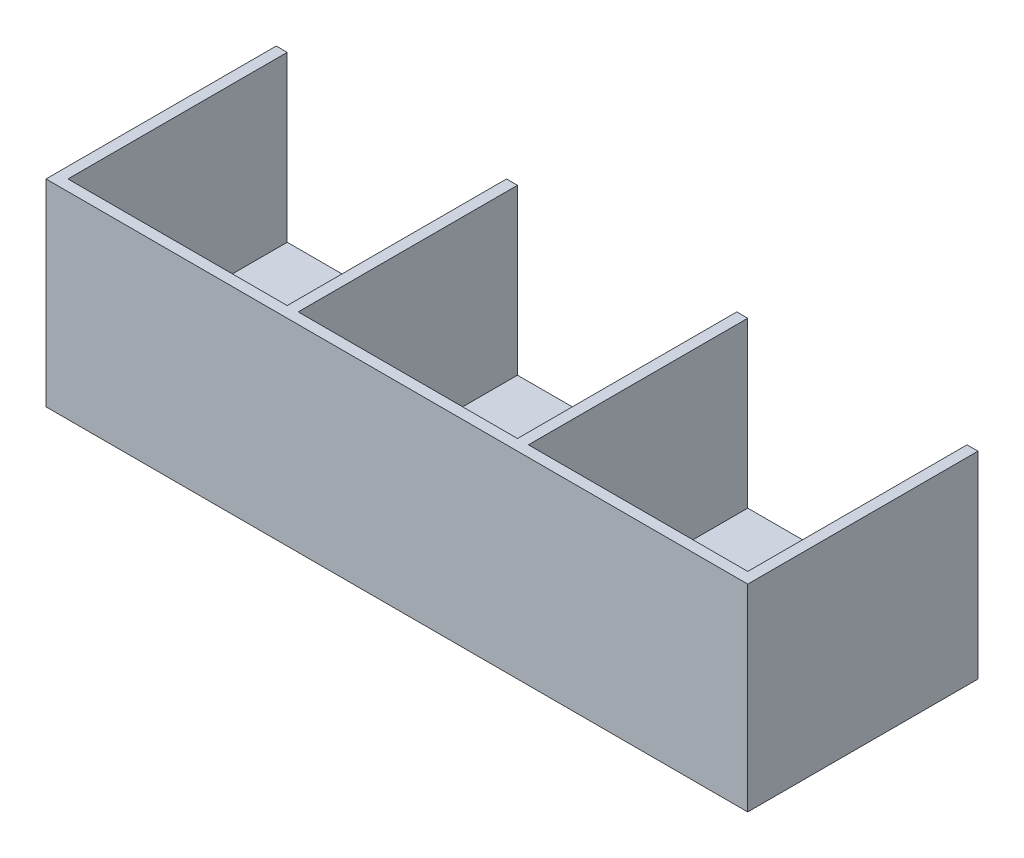
ISO-10303-21;
HEADER;
FILE_DESCRIPTION(('STEP AP214'),'2;1');
FILE_NAME('part.step','',(''),(''),'','','');
FILE_SCHEMA(('AUTOMOTIVE_DESIGN { 1 0 10303 214 1 1 1 1 }'));
ENDSEC;
DATA;
#1=APPLICATION_CONTEXT('core data for automotive mechanical design processes');
#2=APPLICATION_PROTOCOL_DEFINITION('international standard','automotive_design',2000,#1);
#3=PRODUCT_CONTEXT('',#1,'mechanical');
#4=PRODUCT('Part','Part','',(#3));
#5=PRODUCT_RELATED_PRODUCT_CATEGORY('part','',(#4));
#6=PRODUCT_DEFINITION_FORMATION('','',#4);
#7=PRODUCT_DEFINITION_CONTEXT('part definition',#1,'design');
#8=PRODUCT_DEFINITION('design','',#6,#7);
#9=PRODUCT_DEFINITION_SHAPE('','',#8);
#10=(LENGTH_UNIT() NAMED_UNIT(*) SI_UNIT(.MILLI.,.METRE.));
#11=(NAMED_UNIT(*) PLANE_ANGLE_UNIT() SI_UNIT($,.RADIAN.));
#12=(NAMED_UNIT(*) SI_UNIT($,.STERADIAN.) SOLID_ANGLE_UNIT());
#13=UNCERTAINTY_MEASURE_WITH_UNIT(LENGTH_MEASURE(1.E-05),#10,'distance_accuracy_value','');
#14=(GEOMETRIC_REPRESENTATION_CONTEXT(3) GLOBAL_UNCERTAINTY_ASSIGNED_CONTEXT((#13)) GLOBAL_UNIT_ASSIGNED_CONTEXT((#10,
#11,#12)) REPRESENTATION_CONTEXT('',''));
#15=CARTESIAN_POINT('',(0.,0.,0.));
#16=DIRECTION('',(0.,0.,1.));
#17=DIRECTION('',(1.,0.,0.));
#18=AXIS2_PLACEMENT_3D('',#15,#16,#17);
#19=CARTESIAN_POINT('',(0.,150.,0.));
#20=DIRECTION('',(0.,1.,0.));
#21=DIRECTION('',(0.,0.,1.));
#22=AXIS2_PLACEMENT_3D('',#19,#20,#21);
#23=PLANE('',#22);
#24=DIRECTION('',(1.,0.,0.));
#25=VECTOR('',#24,1.);
#26=CARTESIAN_POINT('',(-320.,150.,-100.));
#27=LINE('',#26,#25);
#28=CARTESIAN_POINT('',(-320.,150.,-100.));
#29=VERTEX_POINT('',#28);
#30=CARTESIAN_POINT('',(-310.,150.,-100.));
#31=VERTEX_POINT('',#30);
#32=EDGE_CURVE('E166',#29,#31,#27,.T.);
#33=ORIENTED_EDGE('',*,*,#32,.F.);
#34=DIRECTION('',(0.,0.,1.));
#35=VECTOR('',#34,1.);
#36=CARTESIAN_POINT('',(-320.,150.,-110.));
#37=LINE('',#36,#35);
#38=CARTESIAN_POINT('',(-320.,150.,110.));
#39=VERTEX_POINT('',#38);
#40=EDGE_CURVE('E66',#29,#39,#37,.T.);
#41=ORIENTED_EDGE('',*,*,#40,.T.);
#42=DIRECTION('',(1.,0.,0.));
#43=VECTOR('',#42,1.);
#44=CARTESIAN_POINT('',(-320.,150.,110.));
#45=LINE('',#44,#43);
#46=CARTESIAN_POINT('',(320.,150.,110.));
#47=VERTEX_POINT('',#46);
#48=EDGE_CURVE('E61',#39,#47,#45,.T.);
#49=ORIENTED_EDGE('',*,*,#48,.T.);
#50=DIRECTION('',(0.,0.,-1.));
#51=VECTOR('',#50,1.);
#52=CARTESIAN_POINT('',(320.,150.,-110.));
#53=LINE('',#52,#51);
#54=CARTESIAN_POINT('',(320.,150.,-100.));
#55=VERTEX_POINT('',#54);
#56=EDGE_CURVE('E331',#47,#55,#53,.T.);
#57=ORIENTED_EDGE('',*,*,#56,.T.);
#58=CARTESIAN_POINT('',(310.,150.,-100.));
#59=VERTEX_POINT('',#58);
#60=EDGE_CURVE('E189',#59,#55,#27,.T.);
#61=ORIENTED_EDGE('',*,*,#60,.F.);
#62=DIRECTION('',(0.,0.,-1.));
#63=VECTOR('',#62,1.);
#64=CARTESIAN_POINT('',(310.,150.,-100.));
#65=LINE('',#64,#63);
#66=CARTESIAN_POINT('',(310.,150.,100.));
#67=VERTEX_POINT('',#66);
#68=EDGE_CURVE('E219',#67,#59,#65,.T.);
#69=ORIENTED_EDGE('',*,*,#68,.F.);
#70=DIRECTION('',(1.,0.,0.));
#71=VECTOR('',#70,1.);
#72=CARTESIAN_POINT('',(110.,150.,100.));
#73=LINE('',#72,#71);
#74=CARTESIAN_POINT('',(110.,150.,100.));
#75=VERTEX_POINT('',#74);
#76=EDGE_CURVE('E215',#75,#67,#73,.T.);
#77=ORIENTED_EDGE('',*,*,#76,.F.);
#78=DIRECTION('',(0.,0.,1.));
#79=VECTOR('',#78,1.);
#80=CARTESIAN_POINT('',(110.,150.,-99.9999999999999));
#81=LINE('',#80,#79);
#82=CARTESIAN_POINT('',(110.,150.,-100.));
#83=VERTEX_POINT('',#82);
#84=EDGE_CURVE('E212',#83,#75,#81,.T.);
#85=ORIENTED_EDGE('',*,*,#84,.F.);
#86=CARTESIAN_POINT('',(100.,150.,-100.));
#87=VERTEX_POINT('',#86);
#88=EDGE_CURVE('E577',#87,#83,#27,.T.);
#89=ORIENTED_EDGE('',*,*,#88,.F.);
#90=DIRECTION('',(0.,0.,-1.));
#91=VECTOR('',#90,1.);
#92=CARTESIAN_POINT('',(100.,150.,-100.));
#93=LINE('',#92,#91);
#94=CARTESIAN_POINT('',(100.,150.,100.));
#95=VERTEX_POINT('',#94);
#96=EDGE_CURVE('E259',#95,#87,#93,.T.);
#97=ORIENTED_EDGE('',*,*,#96,.F.);
#98=DIRECTION('',(1.,0.,0.));
#99=VECTOR('',#98,1.);
#100=CARTESIAN_POINT('',(-100.,150.,100.));
#101=LINE('',#100,#99);
#102=CARTESIAN_POINT('',(-100.,150.,100.));
#103=VERTEX_POINT('',#102);
#104=EDGE_CURVE('E255',#103,#95,#101,.T.);
#105=ORIENTED_EDGE('',*,*,#104,.F.);
#106=DIRECTION('',(0.,0.,1.));
#107=VECTOR('',#106,1.);
#108=CARTESIAN_POINT('',(-100.,150.,-100.));
#109=LINE('',#108,#107);
#110=CARTESIAN_POINT('',(-100.,150.,-100.));
#111=VERTEX_POINT('',#110);
#112=EDGE_CURVE('E252',#111,#103,#109,.T.);
#113=ORIENTED_EDGE('',*,*,#112,.F.);
#114=CARTESIAN_POINT('',(-110.,150.,-100.));
#115=VERTEX_POINT('',#114);
#116=EDGE_CURVE('E192',#115,#111,#27,.T.);
#117=ORIENTED_EDGE('',*,*,#116,.F.);
#118=DIRECTION('',(0.,0.,-1.));
#119=VECTOR('',#118,1.);
#120=CARTESIAN_POINT('',(-110.,150.,-100.));
#121=LINE('',#120,#119);
#122=CARTESIAN_POINT('',(-110.,150.,100.));
#123=VERTEX_POINT('',#122);
#124=EDGE_CURVE('E299',#123,#115,#121,.T.);
#125=ORIENTED_EDGE('',*,*,#124,.F.);
#126=DIRECTION('',(1.,0.,0.));
#127=VECTOR('',#126,1.);
#128=CARTESIAN_POINT('',(-310.,150.,100.));
#129=LINE('',#128,#127);
#130=CARTESIAN_POINT('',(-310.,150.,100.));
#131=VERTEX_POINT('',#130);
#132=EDGE_CURVE('E295',#131,#123,#129,.T.);
#133=ORIENTED_EDGE('',*,*,#132,.F.);
#134=DIRECTION('',(0.,0.,1.));
#135=VECTOR('',#134,1.);
#136=CARTESIAN_POINT('',(-310.,150.,-100.));
#137=LINE('',#136,#135);
#138=EDGE_CURVE('E292',#31,#131,#137,.T.);
#139=ORIENTED_EDGE('',*,*,#138,.F.);
#140=EDGE_LOOP('',(#33,#41,#49,#57,#61,#69,#77,#85,#89,#97,#105,#113,#117,#125,#133,#139));
#141=FACE_BOUND('',#140,.T.);
#142=ADVANCED_FACE('F45',(#141),#23,.T.);
#143=CARTESIAN_POINT('',(320.,150.,-110.));
#144=DIRECTION('',(-1.,0.,0.));
#145=DIRECTION('',(0.,0.,1.));
#146=AXIS2_PLACEMENT_3D('',#143,#144,#145);
#147=PLANE('',#146);
#148=DIRECTION('',(0.,-1.,0.));
#149=VECTOR('',#148,1.);
#150=CARTESIAN_POINT('',(320.,150.,110.));
#151=LINE('',#150,#149);
#152=CARTESIAN_POINT('',(320.,-30.,110.));
#153=VERTEX_POINT('',#152);
#154=EDGE_CURVE('E54',#47,#153,#151,.T.);
#155=ORIENTED_EDGE('',*,*,#154,.T.);
#156=DIRECTION('',(0.,0.,1.));
#157=VECTOR('',#156,1.);
#158=CARTESIAN_POINT('',(320.,-30.,110.));
#159=LINE('',#158,#157);
#160=CARTESIAN_POINT('',(320.,-30.,-100.));
#161=VERTEX_POINT('',#160);
#162=EDGE_CURVE('E176',#161,#153,#159,.T.);
#163=ORIENTED_EDGE('',*,*,#162,.F.);
#164=DIRECTION('',(0.,1.,0.));
#165=VECTOR('',#164,1.);
#166=CARTESIAN_POINT('',(320.,-10.,-100.));
#167=LINE('',#166,#165);
#168=EDGE_CURVE('E165',#161,#55,#167,.T.);
#169=ORIENTED_EDGE('',*,*,#168,.T.);
#170=ORIENTED_EDGE('',*,*,#56,.F.);
#171=EDGE_LOOP('',(#155,#163,#169,#170));
#172=FACE_BOUND('',#171,.T.);
#173=ADVANCED_FACE('F47',(#172),#147,.F.);
#174=CARTESIAN_POINT('',(-320.,150.,-110.));
#175=DIRECTION('',(1.,0.,0.));
#176=DIRECTION('',(0.,0.,-1.));
#177=AXIS2_PLACEMENT_3D('',#174,#175,#176);
#178=PLANE('',#177);
#179=ORIENTED_EDGE('',*,*,#40,.F.);
#180=DIRECTION('',(0.,1.,0.));
#181=VECTOR('',#180,1.);
#182=CARTESIAN_POINT('',(-320.,-10.,-100.));
#183=LINE('',#182,#181);
#184=CARTESIAN_POINT('',(-320.,-30.,-100.));
#185=VERTEX_POINT('',#184);
#186=EDGE_CURVE('E158',#185,#29,#183,.T.);
#187=ORIENTED_EDGE('',*,*,#186,.F.);
#188=DIRECTION('',(0.,0.,-1.));
#189=VECTOR('',#188,1.);
#190=CARTESIAN_POINT('',(-320.,-30.,110.));
#191=LINE('',#190,#189);
#192=CARTESIAN_POINT('',(-320.,-30.,110.));
#193=VERTEX_POINT('',#192);
#194=EDGE_CURVE('E162',#193,#185,#191,.T.);
#195=ORIENTED_EDGE('',*,*,#194,.F.);
#196=DIRECTION('',(0.,-1.,0.));
#197=VECTOR('',#196,1.);
#198=CARTESIAN_POINT('',(-320.,150.,110.));
#199=LINE('',#198,#197);
#200=EDGE_CURVE('E11',#39,#193,#199,.T.);
#201=ORIENTED_EDGE('',*,*,#200,.F.);
#202=EDGE_LOOP('',(#179,#187,#195,#201));
#203=FACE_BOUND('',#202,.T.);
#204=ADVANCED_FACE('F160',(#203),#178,.F.);
#205=CARTESIAN_POINT('',(-320.,150.,110.));
#206=DIRECTION('',(0.,0.,-1.));
#207=DIRECTION('',(-1.,0.,0.));
#208=AXIS2_PLACEMENT_3D('',#205,#206,#207);
#209=PLANE('',#208);
#210=ORIENTED_EDGE('',*,*,#200,.T.);
#211=DIRECTION('',(-1.,0.,0.));
#212=VECTOR('',#211,1.);
#213=CARTESIAN_POINT('',(-320.,-30.,110.));
#214=LINE('',#213,#212);
#215=EDGE_CURVE('E181',#153,#193,#214,.T.);
#216=ORIENTED_EDGE('',*,*,#215,.F.);
#217=ORIENTED_EDGE('',*,*,#154,.F.);
#218=ORIENTED_EDGE('',*,*,#48,.F.);
#219=EDGE_LOOP('',(#210,#216,#217,#218));
#220=FACE_BOUND('',#219,.T.);
#221=ADVANCED_FACE('F341',(#220),#209,.F.);
#222=CARTESIAN_POINT('',(-310.,150.,-100.));
#223=DIRECTION('',(1.,0.,0.));
#224=DIRECTION('',(0.,0.,-1.));
#225=AXIS2_PLACEMENT_3D('',#222,#223,#224);
#226=PLANE('',#225);
#227=DIRECTION('',(0.,0.,1.));
#228=VECTOR('',#227,1.);
#229=CARTESIAN_POINT('',(-310.,0.,-100.));
#230=LINE('',#229,#228);
#231=CARTESIAN_POINT('',(-310.,0.,-100.));
#232=VERTEX_POINT('',#231);
#233=CARTESIAN_POINT('',(-310.,0.,100.));
#234=VERTEX_POINT('',#233);
#235=EDGE_CURVE('E291',#232,#234,#230,.T.);
#236=ORIENTED_EDGE('',*,*,#235,.F.);
#237=DIRECTION('',(0.,-1.,0.));
#238=VECTOR('',#237,1.);
#239=CARTESIAN_POINT('',(-310.,150.,-100.));
#240=LINE('',#239,#238);
#241=EDGE_CURVE('E303',#31,#232,#240,.T.);
#242=ORIENTED_EDGE('',*,*,#241,.F.);
#243=ORIENTED_EDGE('',*,*,#138,.T.);
#244=DIRECTION('',(0.,-1.,0.));
#245=VECTOR('',#244,1.);
#246=CARTESIAN_POINT('',(-310.,150.,100.));
#247=LINE('',#246,#245);
#248=EDGE_CURVE('E327',#131,#234,#247,.T.);
#249=ORIENTED_EDGE('',*,*,#248,.T.);
#250=EDGE_LOOP('',(#236,#242,#243,#249));
#251=FACE_BOUND('',#250,.T.);
#252=ADVANCED_FACE('F343',(#251),#226,.T.);
#253=CARTESIAN_POINT('',(-310.,150.,100.));
#254=DIRECTION('',(0.,0.,-1.));
#255=DIRECTION('',(-1.,0.,0.));
#256=AXIS2_PLACEMENT_3D('',#253,#254,#255);
#257=PLANE('',#256);
#258=DIRECTION('',(1.,0.,0.));
#259=VECTOR('',#258,1.);
#260=CARTESIAN_POINT('',(-310.,0.,100.));
#261=LINE('',#260,#259);
#262=CARTESIAN_POINT('',(-110.,0.,100.));
#263=VERTEX_POINT('',#262);
#264=EDGE_CURVE('E307',#234,#263,#261,.T.);
#265=ORIENTED_EDGE('',*,*,#264,.F.);
#266=ORIENTED_EDGE('',*,*,#248,.F.);
#267=ORIENTED_EDGE('',*,*,#132,.T.);
#268=DIRECTION('',(0.,-1.,0.));
#269=VECTOR('',#268,1.);
#270=CARTESIAN_POINT('',(-110.,150.,100.));
#271=LINE('',#270,#269);
#272=EDGE_CURVE('E324',#123,#263,#271,.T.);
#273=ORIENTED_EDGE('',*,*,#272,.T.);
#274=EDGE_LOOP('',(#265,#266,#267,#273));
#275=FACE_BOUND('',#274,.T.);
#276=ADVANCED_FACE('F350',(#275),#257,.T.);
#277=CARTESIAN_POINT('',(-110.,150.,-100.));
#278=DIRECTION('',(-1.,0.,0.));
#279=DIRECTION('',(0.,0.,1.));
#280=AXIS2_PLACEMENT_3D('',#277,#278,#279);
#281=PLANE('',#280);
#282=DIRECTION('',(0.,0.,-1.));
#283=VECTOR('',#282,1.);
#284=CARTESIAN_POINT('',(-110.,0.,-100.));
#285=LINE('',#284,#283);
#286=CARTESIAN_POINT('',(-110.,0.,-100.));
#287=VERTEX_POINT('',#286);
#288=EDGE_CURVE('E311',#263,#287,#285,.T.);
#289=ORIENTED_EDGE('',*,*,#288,.F.);
#290=ORIENTED_EDGE('',*,*,#272,.F.);
#291=ORIENTED_EDGE('',*,*,#124,.T.);
#292=DIRECTION('',(0.,-1.,0.));
#293=VECTOR('',#292,1.);
#294=CARTESIAN_POINT('',(-110.,150.,-100.));
#295=LINE('',#294,#293);
#296=EDGE_CURVE('E320',#115,#287,#295,.T.);
#297=ORIENTED_EDGE('',*,*,#296,.T.);
#298=EDGE_LOOP('',(#289,#290,#291,#297));
#299=FACE_BOUND('',#298,.T.);
#300=ADVANCED_FACE('F362',(#299),#281,.T.);
#301=CARTESIAN_POINT('',(-100.,150.,-100.));
#302=DIRECTION('',(1.,0.,0.));
#303=DIRECTION('',(0.,0.,-1.));
#304=AXIS2_PLACEMENT_3D('',#301,#302,#303);
#305=PLANE('',#304);
#306=DIRECTION('',(0.,0.,1.));
#307=VECTOR('',#306,1.);
#308=CARTESIAN_POINT('',(-100.,0.,-100.));
#309=LINE('',#308,#307);
#310=CARTESIAN_POINT('',(-100.,0.,-100.));
#311=VERTEX_POINT('',#310);
#312=CARTESIAN_POINT('',(-100.,0.,100.));
#313=VERTEX_POINT('',#312);
#314=EDGE_CURVE('E251',#311,#313,#309,.T.);
#315=ORIENTED_EDGE('',*,*,#314,.F.);
#316=DIRECTION('',(0.,-1.,0.));
#317=VECTOR('',#316,1.);
#318=CARTESIAN_POINT('',(-100.,150.,-100.));
#319=LINE('',#318,#317);
#320=EDGE_CURVE('E263',#111,#311,#319,.T.);
#321=ORIENTED_EDGE('',*,*,#320,.F.);
#322=ORIENTED_EDGE('',*,*,#112,.T.);
#323=DIRECTION('',(0.,-1.,0.));
#324=VECTOR('',#323,1.);
#325=CARTESIAN_POINT('',(-100.,150.,100.));
#326=LINE('',#325,#324);
#327=EDGE_CURVE('E287',#103,#313,#326,.T.);
#328=ORIENTED_EDGE('',*,*,#327,.T.);
#329=EDGE_LOOP('',(#315,#321,#322,#328));
#330=FACE_BOUND('',#329,.T.);
#331=ADVANCED_FACE('F366',(#330),#305,.T.);
#332=CARTESIAN_POINT('',(-100.,150.,100.));
#333=DIRECTION('',(0.,0.,-1.));
#334=DIRECTION('',(-1.,0.,0.));
#335=AXIS2_PLACEMENT_3D('',#332,#333,#334);
#336=PLANE('',#335);
#337=DIRECTION('',(1.,0.,0.));
#338=VECTOR('',#337,1.);
#339=CARTESIAN_POINT('',(-100.,0.,100.));
#340=LINE('',#339,#338);
#341=CARTESIAN_POINT('',(100.,0.,100.));
#342=VERTEX_POINT('',#341);
#343=EDGE_CURVE('E267',#313,#342,#340,.T.);
#344=ORIENTED_EDGE('',*,*,#343,.F.);
#345=ORIENTED_EDGE('',*,*,#327,.F.);
#346=ORIENTED_EDGE('',*,*,#104,.T.);
#347=DIRECTION('',(0.,-1.,0.));
#348=VECTOR('',#347,1.);
#349=CARTESIAN_POINT('',(100.,150.,100.));
#350=LINE('',#349,#348);
#351=EDGE_CURVE('E284',#95,#342,#350,.T.);
#352=ORIENTED_EDGE('',*,*,#351,.T.);
#353=EDGE_LOOP('',(#344,#345,#346,#352));
#354=FACE_BOUND('',#353,.T.);
#355=ADVANCED_FACE('F370',(#354),#336,.T.);
#356=CARTESIAN_POINT('',(100.,150.,-100.));
#357=DIRECTION('',(-1.,0.,0.));
#358=DIRECTION('',(0.,0.,1.));
#359=AXIS2_PLACEMENT_3D('',#356,#357,#358);
#360=PLANE('',#359);
#361=DIRECTION('',(0.,0.,-1.));
#362=VECTOR('',#361,1.);
#363=CARTESIAN_POINT('',(100.,0.,-100.));
#364=LINE('',#363,#362);
#365=CARTESIAN_POINT('',(100.,0.,-100.));
#366=VERTEX_POINT('',#365);
#367=EDGE_CURVE('E271',#342,#366,#364,.T.);
#368=ORIENTED_EDGE('',*,*,#367,.F.);
#369=ORIENTED_EDGE('',*,*,#351,.F.);
#370=ORIENTED_EDGE('',*,*,#96,.T.);
#371=DIRECTION('',(0.,-1.,0.));
#372=VECTOR('',#371,1.);
#373=CARTESIAN_POINT('',(100.,150.,-100.));
#374=LINE('',#373,#372);
#375=EDGE_CURVE('E280',#87,#366,#374,.T.);
#376=ORIENTED_EDGE('',*,*,#375,.T.);
#377=EDGE_LOOP('',(#368,#369,#370,#376));
#378=FACE_BOUND('',#377,.T.);
#379=ADVANCED_FACE('F374',(#378),#360,.T.);
#380=CARTESIAN_POINT('',(110.,150.,-99.9999999999999));
#381=DIRECTION('',(1.,0.,0.));
#382=DIRECTION('',(0.,0.,-1.));
#383=AXIS2_PLACEMENT_3D('',#380,#381,#382);
#384=PLANE('',#383);
#385=DIRECTION('',(0.,0.,1.));
#386=VECTOR('',#385,1.);
#387=CARTESIAN_POINT('',(110.,0.,-99.9999999999999));
#388=LINE('',#387,#386);
#389=CARTESIAN_POINT('',(110.,0.,-100.));
#390=VERTEX_POINT('',#389);
#391=CARTESIAN_POINT('',(110.,0.,100.));
#392=VERTEX_POINT('',#391);
#393=EDGE_CURVE('E200',#390,#392,#388,.T.);
#394=ORIENTED_EDGE('',*,*,#393,.F.);
#395=DIRECTION('',(0.,-1.,0.));
#396=VECTOR('',#395,1.);
#397=CARTESIAN_POINT('',(110.,150.,-99.9999999999999));
#398=LINE('',#397,#396);
#399=EDGE_CURVE('E223',#83,#390,#398,.T.);
#400=ORIENTED_EDGE('',*,*,#399,.F.);
#401=ORIENTED_EDGE('',*,*,#84,.T.);
#402=DIRECTION('',(0.,-1.,0.));
#403=VECTOR('',#402,1.);
#404=CARTESIAN_POINT('',(110.,150.,100.));
#405=LINE('',#404,#403);
#406=EDGE_CURVE('E247',#75,#392,#405,.T.);
#407=ORIENTED_EDGE('',*,*,#406,.T.);
#408=EDGE_LOOP('',(#394,#400,#401,#407));
#409=FACE_BOUND('',#408,.T.);
#410=ADVANCED_FACE('F378',(#409),#384,.T.);
#411=CARTESIAN_POINT('',(110.,150.,100.));
#412=DIRECTION('',(0.,0.,-1.));
#413=DIRECTION('',(-1.,0.,0.));
#414=AXIS2_PLACEMENT_3D('',#411,#412,#413);
#415=PLANE('',#414);
#416=DIRECTION('',(1.,0.,0.));
#417=VECTOR('',#416,1.);
#418=CARTESIAN_POINT('',(110.,0.,100.));
#419=LINE('',#418,#417);
#420=CARTESIAN_POINT('',(310.,0.,100.));
#421=VERTEX_POINT('',#420);
#422=EDGE_CURVE('E227',#392,#421,#419,.T.);
#423=ORIENTED_EDGE('',*,*,#422,.F.);
#424=ORIENTED_EDGE('',*,*,#406,.F.);
#425=ORIENTED_EDGE('',*,*,#76,.T.);
#426=DIRECTION('',(0.,-1.,0.));
#427=VECTOR('',#426,1.);
#428=CARTESIAN_POINT('',(310.,150.,100.));
#429=LINE('',#428,#427);
#430=EDGE_CURVE('E244',#67,#421,#429,.T.);
#431=ORIENTED_EDGE('',*,*,#430,.T.);
#432=EDGE_LOOP('',(#423,#424,#425,#431));
#433=FACE_BOUND('',#432,.T.);
#434=ADVANCED_FACE('F382',(#433),#415,.T.);
#435=CARTESIAN_POINT('',(310.,150.,-100.));
#436=DIRECTION('',(-1.,0.,0.));
#437=DIRECTION('',(0.,0.,1.));
#438=AXIS2_PLACEMENT_3D('',#435,#436,#437);
#439=PLANE('',#438);
#440=DIRECTION('',(0.,0.,-1.));
#441=VECTOR('',#440,1.);
#442=CARTESIAN_POINT('',(310.,0.,-100.));
#443=LINE('',#442,#441);
#444=CARTESIAN_POINT('',(310.,0.,-100.));
#445=VERTEX_POINT('',#444);
#446=EDGE_CURVE('E231',#421,#445,#443,.T.);
#447=ORIENTED_EDGE('',*,*,#446,.F.);
#448=ORIENTED_EDGE('',*,*,#430,.F.);
#449=ORIENTED_EDGE('',*,*,#68,.T.);
#450=DIRECTION('',(0.,-1.,0.));
#451=VECTOR('',#450,1.);
#452=CARTESIAN_POINT('',(310.,150.,-100.));
#453=LINE('',#452,#451);
#454=EDGE_CURVE('E240',#59,#445,#453,.T.);
#455=ORIENTED_EDGE('',*,*,#454,.T.);
#456=EDGE_LOOP('',(#447,#448,#449,#455));
#457=FACE_BOUND('',#456,.T.);
#458=ADVANCED_FACE('F386',(#457),#439,.T.);
#459=CARTESIAN_POINT('',(0.,0.,0.));
#460=DIRECTION('',(0.,-1.,0.));
#461=DIRECTION('',(0.,0.,-1.));
#462=AXIS2_PLACEMENT_3D('',#459,#460,#461);
#463=PLANE('',#462);
#464=CARTESIAN_POINT('',(210.,0.,-73.4506256093182));
#465=DIRECTION('',(0.,1.,0.));
#466=DIRECTION('',(0.,0.,1.));
#467=AXIS2_PLACEMENT_3D('',#464,#465,#466);
#468=CIRCLE('',#467,4.62649554513581);
#469=CARTESIAN_POINT('',(210.,0.,-68.8241300641824));
#470=VERTEX_POINT('',#469);
#471=EDGE_CURVE('E205',#470,#470,#468,.T.);
#472=ORIENTED_EDGE('',*,*,#471,.F.);
#473=EDGE_LOOP('',(#472));
#474=FACE_BOUND('',#473,.T.);
#475=DIRECTION('',(-1.,0.,0.));
#476=VECTOR('',#475,1.);
#477=CARTESIAN_POINT('',(110.,0.,-99.9999999999999));
#478=LINE('',#477,#476);
#479=EDGE_CURVE('E216',#445,#390,#478,.T.);
#480=ORIENTED_EDGE('',*,*,#479,.T.);
#481=ORIENTED_EDGE('',*,*,#393,.T.);
#482=ORIENTED_EDGE('',*,*,#422,.T.);
#483=ORIENTED_EDGE('',*,*,#446,.T.);
#484=EDGE_LOOP('',(#480,#481,#482,#483));
#485=FACE_BOUND('',#484,.T.);
#486=ADVANCED_FACE('F390',(#474,#485),#463,.F.);
#487=CARTESIAN_POINT('',(-210.,0.,-73.4506256093182));
#488=DIRECTION('',(0.,1.,0.));
#489=DIRECTION('',(0.,0.,1.));
#490=AXIS2_PLACEMENT_3D('',#487,#488,#489);
#491=CIRCLE('',#490,4.62649554513581);
#492=CARTESIAN_POINT('',(-210.,0.,-68.8241300641824));
#493=VERTEX_POINT('',#492);
#494=EDGE_CURVE('E201',#493,#493,#491,.T.);
#495=ORIENTED_EDGE('',*,*,#494,.F.);
#496=EDGE_LOOP('',(#495));
#497=FACE_BOUND('',#496,.T.);
#498=DIRECTION('',(-1.,0.,0.));
#499=VECTOR('',#498,1.);
#500=CARTESIAN_POINT('',(-310.,0.,-100.));
#501=LINE('',#500,#499);
#502=EDGE_CURVE('E296',#287,#232,#501,.T.);
#503=ORIENTED_EDGE('',*,*,#502,.T.);
#504=ORIENTED_EDGE('',*,*,#235,.T.);
#505=ORIENTED_EDGE('',*,*,#264,.T.);
#506=ORIENTED_EDGE('',*,*,#288,.T.);
#507=EDGE_LOOP('',(#503,#504,#505,#506));
#508=FACE_BOUND('',#507,.T.);
#509=ADVANCED_FACE('F396',(#497,#508),#463,.F.);
#510=DIRECTION('',(-1.,0.,0.));
#511=VECTOR('',#510,1.);
#512=CARTESIAN_POINT('',(-100.,0.,-100.));
#513=LINE('',#512,#511);
#514=EDGE_CURVE('E256',#366,#311,#513,.T.);
#515=ORIENTED_EDGE('',*,*,#514,.T.);
#516=ORIENTED_EDGE('',*,*,#314,.T.);
#517=ORIENTED_EDGE('',*,*,#343,.T.);
#518=ORIENTED_EDGE('',*,*,#367,.T.);
#519=EDGE_LOOP('',(#515,#516,#517,#518));
#520=FACE_BOUND('',#519,.T.);
#521=ADVANCED_FACE('F392',(#520),#463,.F.);
#522=CARTESIAN_POINT('',(210.,-10.,-73.4506256093182));
#523=DIRECTION('',(0.,1.,0.));
#524=DIRECTION('',(0.,0.,1.));
#525=AXIS2_PLACEMENT_3D('',#522,#523,#524);
#526=CYLINDRICAL_SURFACE('',#525,4.62649554513581);
#527=CARTESIAN_POINT('',(210.,-10.,-73.4506256093182));
#528=DIRECTION('',(0.,1.,0.));
#529=DIRECTION('',(0.,0.,1.));
#530=AXIS2_PLACEMENT_3D('',#527,#528,#529);
#531=CIRCLE('',#530,4.62649554513581);
#532=CARTESIAN_POINT('',(210.,-10.,-68.8241300641824));
#533=VERTEX_POINT('',#532);
#534=EDGE_CURVE('E194',#533,#533,#531,.T.);
#535=ORIENTED_EDGE('',*,*,#534,.F.);
#536=EDGE_LOOP('',(#535));
#537=FACE_BOUND('',#536,.T.);
#538=ORIENTED_EDGE('',*,*,#471,.T.);
#539=EDGE_LOOP('',(#538));
#540=FACE_BOUND('',#539,.T.);
#541=ADVANCED_FACE('F395',(#537,#540),#526,.F.);
#542=CARTESIAN_POINT('',(-210.,-10.,-73.4506256093182));
#543=DIRECTION('',(0.,1.,0.));
#544=DIRECTION('',(0.,0.,1.));
#545=AXIS2_PLACEMENT_3D('',#542,#543,#544);
#546=CYLINDRICAL_SURFACE('',#545,4.62649554513581);
#547=CARTESIAN_POINT('',(-210.,-10.,-73.4506256093182));
#548=DIRECTION('',(0.,1.,0.));
#549=DIRECTION('',(0.,0.,1.));
#550=AXIS2_PLACEMENT_3D('',#547,#548,#549);
#551=CIRCLE('',#550,4.62649554513581);
#552=CARTESIAN_POINT('',(-210.,-10.,-68.8241300641824));
#553=VERTEX_POINT('',#552);
#554=EDGE_CURVE('E196',#553,#553,#551,.T.);
#555=ORIENTED_EDGE('',*,*,#554,.F.);
#556=EDGE_LOOP('',(#555));
#557=FACE_BOUND('',#556,.T.);
#558=ORIENTED_EDGE('',*,*,#494,.T.);
#559=EDGE_LOOP('',(#558));
#560=FACE_BOUND('',#559,.T.);
#561=ADVANCED_FACE('F400',(#557,#560),#546,.F.);
#562=CARTESIAN_POINT('',(-320.,-10.,-100.));
#563=DIRECTION('',(0.,0.,1.));
#564=DIRECTION('',(1.,0.,0.));
#565=AXIS2_PLACEMENT_3D('',#562,#563,#564);
#566=PLANE('',#565);
#567=ORIENTED_EDGE('',*,*,#399,.T.);
#568=ORIENTED_EDGE('',*,*,#479,.F.);
#569=ORIENTED_EDGE('',*,*,#454,.F.);
#570=ORIENTED_EDGE('',*,*,#60,.T.);
#571=ORIENTED_EDGE('',*,*,#168,.F.);
#572=DIRECTION('',(1.,0.,0.));
#573=VECTOR('',#572,1.);
#574=CARTESIAN_POINT('',(-320.,-30.,-100.));
#575=LINE('',#574,#573);
#576=EDGE_CURVE('E169',#185,#161,#575,.T.);
#577=ORIENTED_EDGE('',*,*,#576,.F.);
#578=ORIENTED_EDGE('',*,*,#186,.T.);
#579=ORIENTED_EDGE('',*,*,#32,.T.);
#580=ORIENTED_EDGE('',*,*,#241,.T.);
#581=ORIENTED_EDGE('',*,*,#502,.F.);
#582=ORIENTED_EDGE('',*,*,#296,.F.);
#583=ORIENTED_EDGE('',*,*,#116,.T.);
#584=ORIENTED_EDGE('',*,*,#320,.T.);
#585=ORIENTED_EDGE('',*,*,#514,.F.);
#586=ORIENTED_EDGE('',*,*,#375,.F.);
#587=ORIENTED_EDGE('',*,*,#88,.T.);
#588=EDGE_LOOP('',(#567,#568,#569,#570,#571,#577,#578,#579,#580,#581,#582,#583,#584,#585,#586,#587));
#589=FACE_BOUND('',#588,.T.);
#590=ADVANCED_FACE('F170',(#589),#566,.F.);
#591=CARTESIAN_POINT('',(0.,-10.,0.));
#592=DIRECTION('',(0.,-1.,0.));
#593=DIRECTION('',(0.,0.,-1.));
#594=AXIS2_PLACEMENT_3D('',#591,#592,#593);
#595=PLANE('',#594);
#596=ORIENTED_EDGE('',*,*,#534,.T.);
#597=EDGE_LOOP('',(#596));
#598=FACE_BOUND('',#597,.T.);
#599=ADVANCED_FACE('F405',(#598),#595,.F.);
#600=ORIENTED_EDGE('',*,*,#554,.T.);
#601=EDGE_LOOP('',(#600));
#602=FACE_BOUND('',#601,.T.);
#603=ADVANCED_FACE('F406',(#602),#595,.F.);
#604=CARTESIAN_POINT('',(0.,-30.,0.));
#605=DIRECTION('',(0.,-1.,0.));
#606=DIRECTION('',(0.,0.,-1.));
#607=AXIS2_PLACEMENT_3D('',#604,#605,#606);
#608=PLANE('',#607);
#609=ORIENTED_EDGE('',*,*,#194,.T.);
#610=ORIENTED_EDGE('',*,*,#576,.T.);
#611=ORIENTED_EDGE('',*,*,#162,.T.);
#612=ORIENTED_EDGE('',*,*,#215,.T.);
#613=EDGE_LOOP('',(#609,#610,#611,#612));
#614=FACE_BOUND('',#613,.T.);
#615=ADVANCED_FACE('F179',(#614),#608,.T.);
#616=CLOSED_SHELL('',(#142,#173,#204,#221,#252,#276,#300,#331,#355,#379,#410,#434,#458,#486,
#509,#521,#541,#561,#590,#599,#603,#615));
#617=MANIFOLD_SOLID_BREP('B2',#616);
#618=ADVANCED_BREP_SHAPE_REPRESENTATION('',(#18,#617),#14);
#619=SHAPE_DEFINITION_REPRESENTATION(#9,#618);
ENDSEC;
END-ISO-10303-21;
